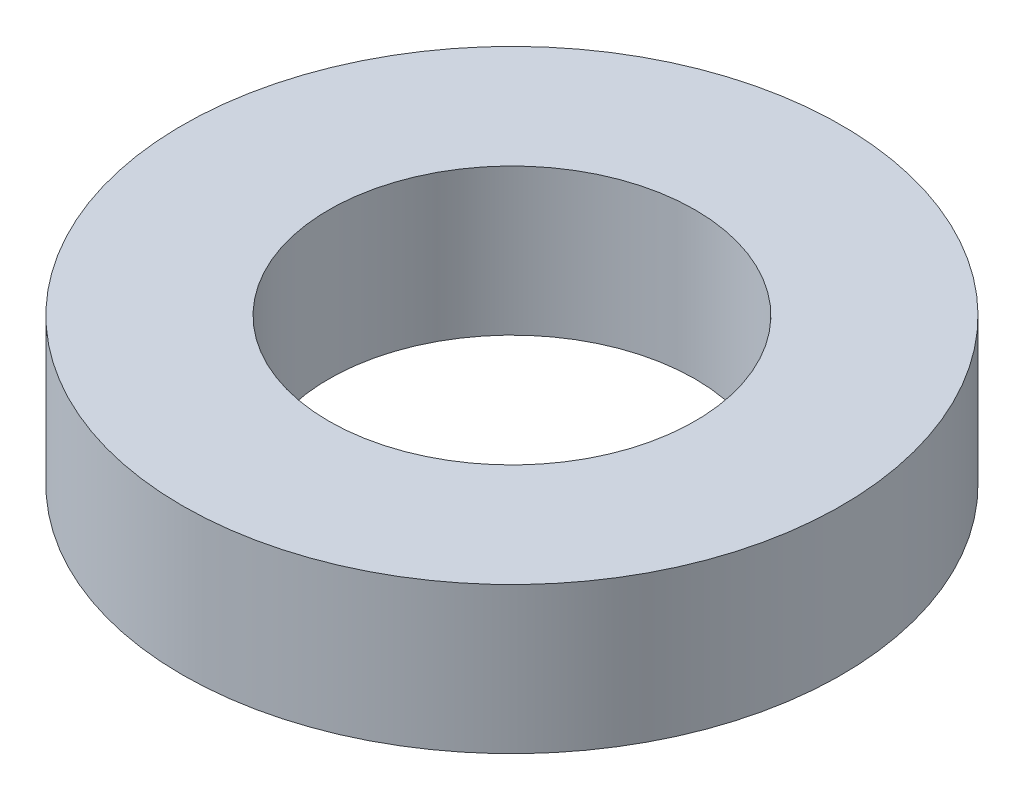
ISO-10303-21;
HEADER;
FILE_DESCRIPTION(('STEP AP214'),'2;1');
FILE_NAME('part.step','',(''),(''),'','','');
FILE_SCHEMA(('AUTOMOTIVE_DESIGN { 1 0 10303 214 1 1 1 1 }'));
ENDSEC;
DATA;
#1=APPLICATION_CONTEXT('core data for automotive mechanical design processes');
#2=APPLICATION_PROTOCOL_DEFINITION('international standard','automotive_design',2000,#1);
#3=PRODUCT_CONTEXT('',#1,'mechanical');
#4=PRODUCT('Part','Part','',(#3));
#5=PRODUCT_RELATED_PRODUCT_CATEGORY('part','',(#4));
#6=PRODUCT_DEFINITION_FORMATION('','',#4);
#7=PRODUCT_DEFINITION_CONTEXT('part definition',#1,'design');
#8=PRODUCT_DEFINITION('design','',#6,#7);
#9=PRODUCT_DEFINITION_SHAPE('','',#8);
#10=(LENGTH_UNIT() NAMED_UNIT(*) SI_UNIT(.MILLI.,.METRE.));
#11=(NAMED_UNIT(*) PLANE_ANGLE_UNIT() SI_UNIT($,.RADIAN.));
#12=(NAMED_UNIT(*) SI_UNIT($,.STERADIAN.) SOLID_ANGLE_UNIT());
#13=UNCERTAINTY_MEASURE_WITH_UNIT(LENGTH_MEASURE(1.E-05),#10,'distance_accuracy_value','');
#14=(GEOMETRIC_REPRESENTATION_CONTEXT(3) GLOBAL_UNCERTAINTY_ASSIGNED_CONTEXT((#13)) GLOBAL_UNIT_ASSIGNED_CONTEXT((#10,
#11,#12)) REPRESENTATION_CONTEXT('',''));
#15=CARTESIAN_POINT('',(0.,0.,0.));
#16=DIRECTION('',(0.,0.,1.));
#17=DIRECTION('',(1.,0.,0.));
#18=AXIS2_PLACEMENT_3D('',#15,#16,#17);
#19=CARTESIAN_POINT('',(0.,2.,0.));
#20=DIRECTION('',(0.,1.,0.));
#21=DIRECTION('',(0.,0.,1.));
#22=AXIS2_PLACEMENT_3D('',#19,#20,#21);
#23=PLANE('',#22);
#24=CARTESIAN_POINT('',(0.,2.,0.));
#25=DIRECTION('',(0.,1.,0.));
#26=DIRECTION('',(0.,0.,1.));
#27=AXIS2_PLACEMENT_3D('',#24,#25,#26);
#28=CIRCLE('',#27,4.5);
#29=CARTESIAN_POINT('',(0.,2.,4.5));
#30=VERTEX_POINT('',#29);
#31=EDGE_CURVE('E10',#30,#30,#28,.T.);
#32=ORIENTED_EDGE('',*,*,#31,.T.);
#33=EDGE_LOOP('',(#32));
#34=FACE_BOUND('',#33,.T.);
#35=CARTESIAN_POINT('',(0.,2.,0.));
#36=DIRECTION('',(0.,1.,0.));
#37=DIRECTION('',(0.,0.,1.));
#38=AXIS2_PLACEMENT_3D('',#35,#36,#37);
#39=CIRCLE('',#38,2.5);
#40=CARTESIAN_POINT('',(0.,2.,2.5));
#41=VERTEX_POINT('',#40);
#42=EDGE_CURVE('E42',#41,#41,#39,.T.);
#43=ORIENTED_EDGE('',*,*,#42,.F.);
#44=EDGE_LOOP('',(#43));
#45=FACE_BOUND('',#44,.T.);
#46=ADVANCED_FACE('F31',(#34,#45),#23,.T.);
#47=CARTESIAN_POINT('',(0.,0.,0.));
#48=DIRECTION('',(0.,1.,0.));
#49=DIRECTION('',(0.,0.,1.));
#50=AXIS2_PLACEMENT_3D('',#47,#48,#49);
#51=PLANE('',#50);
#52=CARTESIAN_POINT('',(0.,0.,0.));
#53=DIRECTION('',(0.,1.,0.));
#54=DIRECTION('',(0.,0.,1.));
#55=AXIS2_PLACEMENT_3D('',#52,#53,#54);
#56=CIRCLE('',#55,4.5);
#57=CARTESIAN_POINT('',(0.,0.,4.5));
#58=VERTEX_POINT('',#57);
#59=EDGE_CURVE('E35',#58,#58,#56,.T.);
#60=ORIENTED_EDGE('',*,*,#59,.F.);
#61=EDGE_LOOP('',(#60));
#62=FACE_BOUND('',#61,.T.);
#63=CARTESIAN_POINT('',(0.,0.,0.));
#64=DIRECTION('',(0.,1.,0.));
#65=DIRECTION('',(0.,0.,1.));
#66=AXIS2_PLACEMENT_3D('',#63,#64,#65);
#67=CIRCLE('',#66,2.5);
#68=CARTESIAN_POINT('',(0.,0.,2.5));
#69=VERTEX_POINT('',#68);
#70=EDGE_CURVE('E44',#69,#69,#67,.T.);
#71=ORIENTED_EDGE('',*,*,#70,.T.);
#72=EDGE_LOOP('',(#71));
#73=FACE_BOUND('',#72,.T.);
#74=ADVANCED_FACE('F54',(#62,#73),#51,.F.);
#75=CARTESIAN_POINT('',(0.,2.,0.));
#76=DIRECTION('',(0.,-1.,0.));
#77=DIRECTION('',(0.,0.,-1.));
#78=AXIS2_PLACEMENT_3D('',#75,#76,#77);
#79=CYLINDRICAL_SURFACE('',#78,4.5);
#80=ORIENTED_EDGE('',*,*,#31,.F.);
#81=EDGE_LOOP('',(#80));
#82=FACE_BOUND('',#81,.T.);
#83=ORIENTED_EDGE('',*,*,#59,.T.);
#84=EDGE_LOOP('',(#83));
#85=FACE_BOUND('',#84,.T.);
#86=ADVANCED_FACE('F33',(#82,#85),#79,.T.);
#87=CARTESIAN_POINT('',(0.,2.,0.));
#88=DIRECTION('',(0.,-1.,0.));
#89=DIRECTION('',(0.,0.,-1.));
#90=AXIS2_PLACEMENT_3D('',#87,#88,#89);
#91=CYLINDRICAL_SURFACE('',#90,2.5);
#92=ORIENTED_EDGE('',*,*,#42,.T.);
#93=EDGE_LOOP('',(#92));
#94=FACE_BOUND('',#93,.T.);
#95=ORIENTED_EDGE('',*,*,#70,.F.);
#96=EDGE_LOOP('',(#95));
#97=FACE_BOUND('',#96,.T.);
#98=ADVANCED_FACE('F50',(#94,#97),#91,.F.);
#99=CLOSED_SHELL('',(#46,#74,#86,#98));
#100=MANIFOLD_SOLID_BREP('B2',#99);
#101=ADVANCED_BREP_SHAPE_REPRESENTATION('',(#18,#100),#14);
#102=SHAPE_DEFINITION_REPRESENTATION(#9,#101);
ENDSEC;
END-ISO-10303-21;
